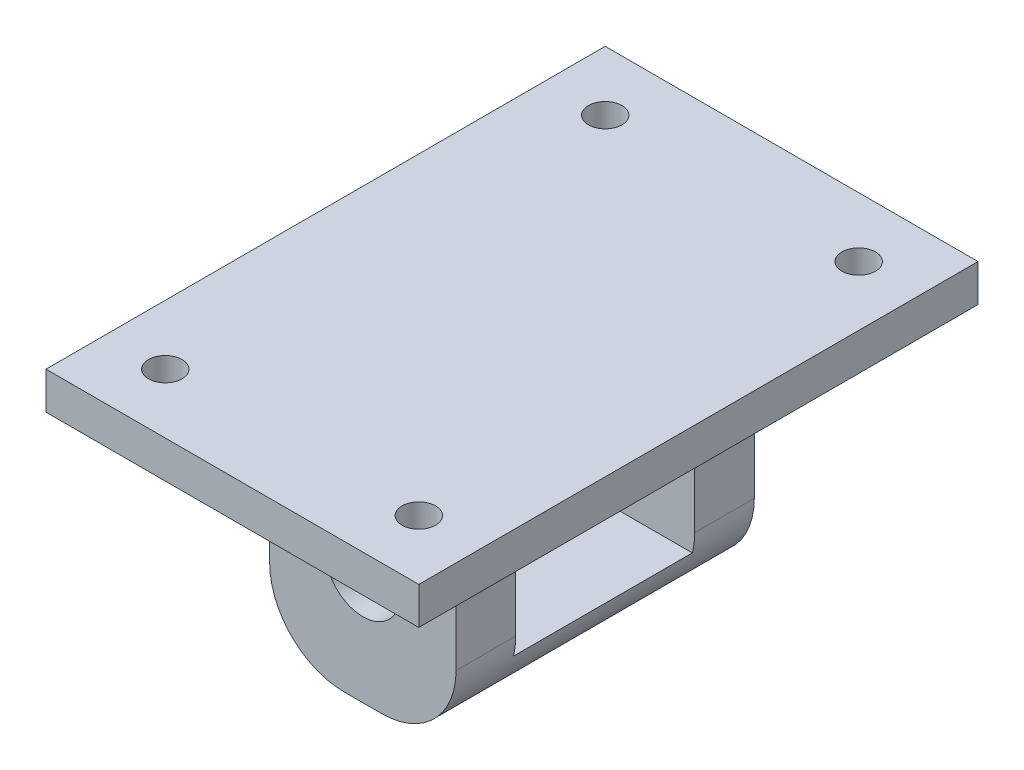
ISO-10303-21;
HEADER;
FILE_DESCRIPTION(('STEP AP214'),'2;1');
FILE_NAME('part.step','',(''),(''),'','','');
FILE_SCHEMA(('AUTOMOTIVE_DESIGN { 1 0 10303 214 1 1 1 1 }'));
ENDSEC;
DATA;
#1=APPLICATION_CONTEXT('core data for automotive mechanical design processes');
#2=APPLICATION_PROTOCOL_DEFINITION('international standard','automotive_design',2000,#1);
#3=PRODUCT_CONTEXT('',#1,'mechanical');
#4=PRODUCT('Part','Part','',(#3));
#5=PRODUCT_RELATED_PRODUCT_CATEGORY('part','',(#4));
#6=PRODUCT_DEFINITION_FORMATION('','',#4);
#7=PRODUCT_DEFINITION_CONTEXT('part definition',#1,'design');
#8=PRODUCT_DEFINITION('design','',#6,#7);
#9=PRODUCT_DEFINITION_SHAPE('','',#8);
#10=(LENGTH_UNIT() NAMED_UNIT(*) SI_UNIT(.MILLI.,.METRE.));
#11=(NAMED_UNIT(*) PLANE_ANGLE_UNIT() SI_UNIT($,.RADIAN.));
#12=(NAMED_UNIT(*) SI_UNIT($,.STERADIAN.) SOLID_ANGLE_UNIT());
#13=UNCERTAINTY_MEASURE_WITH_UNIT(LENGTH_MEASURE(1.E-05),#10,'distance_accuracy_value','');
#14=(GEOMETRIC_REPRESENTATION_CONTEXT(3) GLOBAL_UNCERTAINTY_ASSIGNED_CONTEXT((#13)) GLOBAL_UNIT_ASSIGNED_CONTEXT((#10,
#11,#12)) REPRESENTATION_CONTEXT('',''));
#15=CARTESIAN_POINT('',(0.,0.,0.));
#16=DIRECTION('',(0.,0.,1.));
#17=DIRECTION('',(1.,0.,0.));
#18=AXIS2_PLACEMENT_3D('',#15,#16,#17);
#19=CARTESIAN_POINT('',(0.,20.,0.));
#20=DIRECTION('',(0.,1.,0.));
#21=DIRECTION('',(-1.,0.,0.));
#22=AXIS2_PLACEMENT_3D('',#19,#20,#21);
#23=PLANE('',#22);
#24=CARTESIAN_POINT('',(17.,20.,-29.5));
#25=DIRECTION('',(0.,-1.,0.));
#26=DIRECTION('',(0.,0.,-1.));
#27=AXIS2_PLACEMENT_3D('',#24,#25,#26);
#28=CIRCLE('',#27,2.25);
#29=CARTESIAN_POINT('',(17.,20.,-31.75));
#30=VERTEX_POINT('',#29);
#31=EDGE_CURVE('E423',#30,#30,#28,.T.);
#32=ORIENTED_EDGE('',*,*,#31,.T.);
#33=EDGE_LOOP('',(#32));
#34=FACE_BOUND('',#33,.T.);
#35=CARTESIAN_POINT('',(-17.,20.,-29.5));
#36=DIRECTION('',(0.,-1.,0.));
#37=DIRECTION('',(0.,0.,-1.));
#38=AXIS2_PLACEMENT_3D('',#35,#36,#37);
#39=CIRCLE('',#38,2.25);
#40=CARTESIAN_POINT('',(-17.,20.,-31.75));
#41=VERTEX_POINT('',#40);
#42=EDGE_CURVE('E436',#41,#41,#39,.T.);
#43=ORIENTED_EDGE('',*,*,#42,.T.);
#44=EDGE_LOOP('',(#43));
#45=FACE_BOUND('',#44,.T.);
#46=DIRECTION('',(0.,0.,1.));
#47=VECTOR('',#46,1.);
#48=CARTESIAN_POINT('',(-25.,20.,37.5));
#49=LINE('',#48,#47);
#50=CARTESIAN_POINT('',(-25.,20.,-37.5));
#51=VERTEX_POINT('',#50);
#52=CARTESIAN_POINT('',(-25.,20.,37.5));
#53=VERTEX_POINT('',#52);
#54=EDGE_CURVE('E164',#51,#53,#49,.T.);
#55=ORIENTED_EDGE('',*,*,#54,.T.);
#56=DIRECTION('',(1.,0.,0.));
#57=VECTOR('',#56,1.);
#58=CARTESIAN_POINT('',(25.,20.,37.5));
#59=LINE('',#58,#57);
#60=CARTESIAN_POINT('',(25.,20.,37.5));
#61=VERTEX_POINT('',#60);
#62=EDGE_CURVE('E152',#53,#61,#59,.T.);
#63=ORIENTED_EDGE('',*,*,#62,.T.);
#64=DIRECTION('',(0.,0.,-1.));
#65=VECTOR('',#64,1.);
#66=CARTESIAN_POINT('',(25.,20.,37.5));
#67=LINE('',#66,#65);
#68=CARTESIAN_POINT('',(25.,20.,-37.5));
#69=VERTEX_POINT('',#68);
#70=EDGE_CURVE('E163',#61,#69,#67,.T.);
#71=ORIENTED_EDGE('',*,*,#70,.T.);
#72=DIRECTION('',(-1.,0.,0.));
#73=VECTOR('',#72,1.);
#74=CARTESIAN_POINT('',(25.,20.,-37.5));
#75=LINE('',#74,#73);
#76=EDGE_CURVE('E169',#69,#51,#75,.T.);
#77=ORIENTED_EDGE('',*,*,#76,.T.);
#78=EDGE_LOOP('',(#55,#63,#71,#77));
#79=FACE_BOUND('',#78,.T.);
#80=CARTESIAN_POINT('',(17.,20.,29.5));
#81=DIRECTION('',(0.,-1.,0.));
#82=DIRECTION('',(0.,0.,-1.));
#83=AXIS2_PLACEMENT_3D('',#80,#81,#82);
#84=CIRCLE('',#83,2.25);
#85=CARTESIAN_POINT('',(17.,20.,27.25));
#86=VERTEX_POINT('',#85);
#87=EDGE_CURVE('E460',#86,#86,#84,.T.);
#88=ORIENTED_EDGE('',*,*,#87,.T.);
#89=EDGE_LOOP('',(#88));
#90=FACE_BOUND('',#89,.T.);
#91=CARTESIAN_POINT('',(-17.,20.,29.5));
#92=DIRECTION('',(0.,-1.,0.));
#93=DIRECTION('',(0.,0.,-1.));
#94=AXIS2_PLACEMENT_3D('',#91,#92,#93);
#95=CIRCLE('',#94,2.25);
#96=CARTESIAN_POINT('',(-17.,20.,27.25));
#97=VERTEX_POINT('',#96);
#98=EDGE_CURVE('E448',#97,#97,#95,.T.);
#99=ORIENTED_EDGE('',*,*,#98,.T.);
#100=EDGE_LOOP('',(#99));
#101=FACE_BOUND('',#100,.T.);
#102=ADVANCED_FACE('F44',(#34,#45,#79,#90,#101),#23,.T.);
#103=CARTESIAN_POINT('',(-12.5,-15.,20.));
#104=DIRECTION('',(1.,0.,0.));
#105=DIRECTION('',(0.,1.,0.));
#106=AXIS2_PLACEMENT_3D('',#103,#104,#105);
#107=PLANE('',#106);
#108=DIRECTION('',(0.,-1.,0.));
#109=VECTOR('',#108,1.);
#110=CARTESIAN_POINT('',(-12.5,-15.,-20.));
#111=LINE('',#110,#109);
#112=CARTESIAN_POINT('',(-12.5,15.,-20.));
#113=VERTEX_POINT('',#112);
#114=CARTESIAN_POINT('',(-12.5,-4.99999999999999,-20.));
#115=VERTEX_POINT('',#114);
#116=EDGE_CURVE('E225',#113,#115,#111,.T.);
#117=ORIENTED_EDGE('',*,*,#116,.T.);
#118=DIRECTION('',(0.,0.,-1.));
#119=VECTOR('',#118,1.);
#120=CARTESIAN_POINT('',(-12.5,-4.99999999999999,20.));
#121=LINE('',#120,#119);
#122=CARTESIAN_POINT('',(-12.5,-4.99999999999999,20.));
#123=VERTEX_POINT('',#122);
#124=EDGE_CURVE('E287',#115,#123,#121,.F.);
#125=ORIENTED_EDGE('',*,*,#124,.T.);
#126=DIRECTION('',(0.,-1.,0.));
#127=VECTOR('',#126,1.);
#128=CARTESIAN_POINT('',(-12.5,-15.,20.));
#129=LINE('',#128,#127);
#130=CARTESIAN_POINT('',(-12.5,15.,20.));
#131=VERTEX_POINT('',#130);
#132=EDGE_CURVE('E226',#131,#123,#129,.T.);
#133=ORIENTED_EDGE('',*,*,#132,.F.);
#134=DIRECTION('',(0.,0.,-1.));
#135=VECTOR('',#134,1.);
#136=CARTESIAN_POINT('',(-12.5,15.,20.));
#137=LINE('',#136,#135);
#138=EDGE_CURVE('E241',#131,#113,#137,.T.);
#139=ORIENTED_EDGE('',*,*,#138,.T.);
#140=EDGE_LOOP('',(#117,#125,#133,#139));
#141=FACE_BOUND('',#140,.T.);
#142=ADVANCED_FACE('F350',(#141),#107,.F.);
#143=CARTESIAN_POINT('',(12.5,-15.,20.));
#144=DIRECTION('',(0.,1.,0.));
#145=DIRECTION('',(0.,0.,1.));
#146=AXIS2_PLACEMENT_3D('',#143,#144,#145);
#147=PLANE('',#146);
#148=DIRECTION('',(1.,0.,0.));
#149=VECTOR('',#148,1.);
#150=CARTESIAN_POINT('',(12.5,-15.,20.));
#151=LINE('',#150,#149);
#152=CARTESIAN_POINT('',(-2.5,-15.,20.));
#153=VERTEX_POINT('',#152);
#154=CARTESIAN_POINT('',(2.5,-15.,20.));
#155=VERTEX_POINT('',#154);
#156=EDGE_CURVE('E230',#153,#155,#151,.T.);
#157=ORIENTED_EDGE('',*,*,#156,.F.);
#158=DIRECTION('',(0.,0.,-1.));
#159=VECTOR('',#158,1.);
#160=CARTESIAN_POINT('',(-2.5,-15.,20.));
#161=LINE('',#160,#159);
#162=CARTESIAN_POINT('',(-2.5,-15.,-20.));
#163=VERTEX_POINT('',#162);
#164=EDGE_CURVE('E277',#153,#163,#161,.T.);
#165=ORIENTED_EDGE('',*,*,#164,.T.);
#166=DIRECTION('',(1.,0.,0.));
#167=VECTOR('',#166,1.);
#168=CARTESIAN_POINT('',(12.5,-15.,-20.));
#169=LINE('',#168,#167);
#170=CARTESIAN_POINT('',(2.5,-15.,-20.));
#171=VERTEX_POINT('',#170);
#172=EDGE_CURVE('E245',#163,#171,#169,.T.);
#173=ORIENTED_EDGE('',*,*,#172,.T.);
#174=DIRECTION('',(0.,0.,-1.));
#175=VECTOR('',#174,1.);
#176=CARTESIAN_POINT('',(2.5,-15.,20.));
#177=LINE('',#176,#175);
#178=EDGE_CURVE('E271',#171,#155,#177,.F.);
#179=ORIENTED_EDGE('',*,*,#178,.T.);
#180=EDGE_LOOP('',(#157,#165,#173,#179));
#181=FACE_BOUND('',#180,.T.);
#182=ADVANCED_FACE('F340',(#181),#147,.F.);
#183=CARTESIAN_POINT('',(12.5,-15.,20.));
#184=DIRECTION('',(-1.,0.,0.));
#185=DIRECTION('',(0.,-1.,0.));
#186=AXIS2_PLACEMENT_3D('',#183,#184,#185);
#187=PLANE('',#186);
#188=DIRECTION('',(0.,1.,0.));
#189=VECTOR('',#188,1.);
#190=CARTESIAN_POINT('',(12.5,-15.,20.));
#191=LINE('',#190,#189);
#192=CARTESIAN_POINT('',(12.5,-4.99999999999999,20.));
#193=VERTEX_POINT('',#192);
#194=CARTESIAN_POINT('',(12.5,15.,20.));
#195=VERTEX_POINT('',#194);
#196=EDGE_CURVE('E235',#193,#195,#191,.T.);
#197=ORIENTED_EDGE('',*,*,#196,.F.);
#198=DIRECTION('',(0.,0.,-1.));
#199=VECTOR('',#198,1.);
#200=CARTESIAN_POINT('',(12.5,-4.99999999999999,20.));
#201=LINE('',#200,#199);
#202=CARTESIAN_POINT('',(12.5,-4.99999999999999,12.));
#203=VERTEX_POINT('',#202);
#204=EDGE_CURVE('E299',#193,#203,#201,.T.);
#205=ORIENTED_EDGE('',*,*,#204,.T.);
#206=DIRECTION('',(0.,1.,0.));
#207=VECTOR('',#206,1.);
#208=CARTESIAN_POINT('',(12.5,-15.,12.));
#209=LINE('',#208,#207);
#210=CARTESIAN_POINT('',(12.5,7.5,12.));
#211=VERTEX_POINT('',#210);
#212=EDGE_CURVE('E268',#203,#211,#209,.T.);
#213=ORIENTED_EDGE('',*,*,#212,.T.);
#214=DIRECTION('',(0.,0.,1.));
#215=VECTOR('',#214,1.);
#216=CARTESIAN_POINT('',(12.5,7.5,20.));
#217=LINE('',#216,#215);
#218=CARTESIAN_POINT('',(12.5,7.5,-12.));
#219=VERTEX_POINT('',#218);
#220=EDGE_CURVE('E264',#219,#211,#217,.T.);
#221=ORIENTED_EDGE('',*,*,#220,.F.);
#222=DIRECTION('',(0.,1.,0.));
#223=VECTOR('',#222,1.);
#224=CARTESIAN_POINT('',(12.5,-15.,-12.));
#225=LINE('',#224,#223);
#226=CARTESIAN_POINT('',(12.5,-4.99999999999999,-12.));
#227=VERTEX_POINT('',#226);
#228=EDGE_CURVE('E261',#227,#219,#225,.T.);
#229=ORIENTED_EDGE('',*,*,#228,.F.);
#230=DIRECTION('',(0.,0.,-1.));
#231=VECTOR('',#230,1.);
#232=CARTESIAN_POINT('',(12.5,-4.99999999999999,20.));
#233=LINE('',#232,#231);
#234=CARTESIAN_POINT('',(12.5,-4.99999999999999,-20.));
#235=VERTEX_POINT('',#234);
#236=EDGE_CURVE('E296',#227,#235,#233,.T.);
#237=ORIENTED_EDGE('',*,*,#236,.T.);
#238=DIRECTION('',(0.,1.,0.));
#239=VECTOR('',#238,1.);
#240=CARTESIAN_POINT('',(12.5,-15.,-20.));
#241=LINE('',#240,#239);
#242=CARTESIAN_POINT('',(12.5,15.,-20.));
#243=VERTEX_POINT('',#242);
#244=EDGE_CURVE('E249',#235,#243,#241,.T.);
#245=ORIENTED_EDGE('',*,*,#244,.T.);
#246=DIRECTION('',(0.,0.,-1.));
#247=VECTOR('',#246,1.);
#248=CARTESIAN_POINT('',(12.5,15.,20.));
#249=LINE('',#248,#247);
#250=EDGE_CURVE('E257',#195,#243,#249,.T.);
#251=ORIENTED_EDGE('',*,*,#250,.F.);
#252=EDGE_LOOP('',(#197,#205,#213,#221,#229,#237,#245,#251));
#253=FACE_BOUND('',#252,.T.);
#254=ADVANCED_FACE('F308',(#253),#187,.F.);
#255=CARTESIAN_POINT('',(0.,0.,20.));
#256=DIRECTION('',(0.,0.,1.));
#257=DIRECTION('',(1.,0.,0.));
#258=AXIS2_PLACEMENT_3D('',#255,#256,#257);
#259=PLANE('',#258);
#260=CARTESIAN_POINT('',(0.,0.,20.));
#261=DIRECTION('',(0.,0.,1.));
#262=DIRECTION('',(1.,0.,0.));
#263=AXIS2_PLACEMENT_3D('',#260,#261,#262);
#264=CIRCLE('',#263,5.);
#265=CARTESIAN_POINT('',(5.,0.,20.));
#266=VERTEX_POINT('',#265);
#267=EDGE_CURVE('E180',#266,#266,#264,.T.);
#268=ORIENTED_EDGE('',*,*,#267,.F.);
#269=EDGE_LOOP('',(#268));
#270=FACE_BOUND('',#269,.T.);
#271=ORIENTED_EDGE('',*,*,#132,.T.);
#272=CARTESIAN_POINT('',(-2.5,-4.99999999999999,20.));
#273=DIRECTION('',(0.,0.,1.));
#274=DIRECTION('',(1.,0.,0.));
#275=AXIS2_PLACEMENT_3D('',#272,#273,#274);
#276=CIRCLE('',#275,10.);
#277=EDGE_CURVE('E293',#123,#153,#276,.T.);
#278=ORIENTED_EDGE('',*,*,#277,.T.);
#279=ORIENTED_EDGE('',*,*,#156,.T.);
#280=CARTESIAN_POINT('',(2.5,-4.99999999999999,20.));
#281=DIRECTION('',(0.,0.,1.));
#282=DIRECTION('',(1.,0.,0.));
#283=AXIS2_PLACEMENT_3D('',#280,#281,#282);
#284=CIRCLE('',#283,10.);
#285=EDGE_CURVE('E290',#155,#193,#284,.T.);
#286=ORIENTED_EDGE('',*,*,#285,.T.);
#287=ORIENTED_EDGE('',*,*,#196,.T.);
#288=DIRECTION('',(-1.,0.,0.));
#289=VECTOR('',#288,1.);
#290=CARTESIAN_POINT('',(12.5,15.,20.));
#291=LINE('',#290,#289);
#292=EDGE_CURVE('E238',#195,#131,#291,.T.);
#293=ORIENTED_EDGE('',*,*,#292,.T.);
#294=EDGE_LOOP('',(#271,#278,#279,#286,#287,#293));
#295=FACE_BOUND('',#294,.T.);
#296=ADVANCED_FACE('F343',(#270,#295),#259,.T.);
#297=CARTESIAN_POINT('',(0.,0.,-20.));
#298=DIRECTION('',(0.,0.,1.));
#299=DIRECTION('',(1.,0.,0.));
#300=AXIS2_PLACEMENT_3D('',#297,#298,#299);
#301=PLANE('',#300);
#302=CARTESIAN_POINT('',(0.,0.,-20.));
#303=DIRECTION('',(0.,0.,1.));
#304=DIRECTION('',(1.,0.,0.));
#305=AXIS2_PLACEMENT_3D('',#302,#303,#304);
#306=CIRCLE('',#305,5.);
#307=CARTESIAN_POINT('',(5.,0.,-20.));
#308=VERTEX_POINT('',#307);
#309=EDGE_CURVE('E185',#308,#308,#306,.T.);
#310=ORIENTED_EDGE('',*,*,#309,.T.);
#311=EDGE_LOOP('',(#310));
#312=FACE_BOUND('',#311,.T.);
#313=ORIENTED_EDGE('',*,*,#172,.F.);
#314=CARTESIAN_POINT('',(-2.5,-4.99999999999999,-20.));
#315=DIRECTION('',(0.,0.,1.));
#316=DIRECTION('',(1.,0.,0.));
#317=AXIS2_PLACEMENT_3D('',#314,#315,#316);
#318=CIRCLE('',#317,10.);
#319=EDGE_CURVE('E284',#163,#115,#318,.F.);
#320=ORIENTED_EDGE('',*,*,#319,.T.);
#321=ORIENTED_EDGE('',*,*,#116,.F.);
#322=DIRECTION('',(-1.,0.,0.));
#323=VECTOR('',#322,1.);
#324=CARTESIAN_POINT('',(12.5,15.,-20.));
#325=LINE('',#324,#323);
#326=EDGE_CURVE('E231',#243,#113,#325,.T.);
#327=ORIENTED_EDGE('',*,*,#326,.F.);
#328=ORIENTED_EDGE('',*,*,#244,.F.);
#329=CARTESIAN_POINT('',(2.5,-4.99999999999999,-20.));
#330=DIRECTION('',(0.,0.,1.));
#331=DIRECTION('',(1.,0.,0.));
#332=AXIS2_PLACEMENT_3D('',#329,#330,#331);
#333=CIRCLE('',#332,10.);
#334=EDGE_CURVE('E281',#235,#171,#333,.F.);
#335=ORIENTED_EDGE('',*,*,#334,.T.);
#336=EDGE_LOOP('',(#313,#320,#321,#327,#328,#335));
#337=FACE_BOUND('',#336,.T.);
#338=ADVANCED_FACE('F335',(#312,#337),#301,.F.);
#339=CARTESIAN_POINT('',(0.,7.5,12.));
#340=DIRECTION('',(0.,-1.,0.));
#341=DIRECTION('',(1.,0.,0.));
#342=AXIS2_PLACEMENT_3D('',#339,#340,#341);
#343=PLANE('',#342);
#344=ORIENTED_EDGE('',*,*,#220,.T.);
#345=DIRECTION('',(-1.,0.,0.));
#346=VECTOR('',#345,1.);
#347=CARTESIAN_POINT('',(0.,7.5,12.));
#348=LINE('',#347,#346);
#349=CARTESIAN_POINT('',(0.,7.5,12.));
#350=VERTEX_POINT('',#349);
#351=EDGE_CURVE('E209',#211,#350,#348,.T.);
#352=ORIENTED_EDGE('',*,*,#351,.T.);
#353=DIRECTION('',(0.,0.,-1.));
#354=VECTOR('',#353,1.);
#355=CARTESIAN_POINT('',(0.,7.5,12.));
#356=LINE('',#355,#354);
#357=CARTESIAN_POINT('',(0.,7.5,-12.));
#358=VERTEX_POINT('',#357);
#359=EDGE_CURVE('E221',#350,#358,#356,.T.);
#360=ORIENTED_EDGE('',*,*,#359,.T.);
#361=DIRECTION('',(-1.,0.,0.));
#362=VECTOR('',#361,1.);
#363=CARTESIAN_POINT('',(0.,7.5,-12.));
#364=LINE('',#363,#362);
#365=EDGE_CURVE('E199',#219,#358,#364,.T.);
#366=ORIENTED_EDGE('',*,*,#365,.F.);
#367=EDGE_LOOP('',(#344,#352,#360,#366));
#368=FACE_BOUND('',#367,.T.);
#369=ADVANCED_FACE('F318',(#368),#343,.T.);
#370=CARTESIAN_POINT('',(21.3989106401337,-7.5,12.));
#371=DIRECTION('',(0.,1.,0.));
#372=DIRECTION('',(0.,0.,1.));
#373=AXIS2_PLACEMENT_3D('',#370,#371,#372);
#374=PLANE('',#373);
#375=DIRECTION('',(1.,0.,0.));
#376=VECTOR('',#375,1.);
#377=CARTESIAN_POINT('',(21.3989106401337,-7.5,12.));
#378=LINE('',#377,#376);
#379=CARTESIAN_POINT('',(0.,-7.5,12.));
#380=VERTEX_POINT('',#379);
#381=CARTESIAN_POINT('',(12.1824583655185,-7.5,12.));
#382=VERTEX_POINT('',#381);
#383=EDGE_CURVE('E215',#380,#382,#378,.T.);
#384=ORIENTED_EDGE('',*,*,#383,.T.);
#385=DIRECTION('',(0.,0.,-1.));
#386=VECTOR('',#385,1.);
#387=CARTESIAN_POINT('',(12.1824583655185,-7.5,12.));
#388=LINE('',#387,#386);
#389=CARTESIAN_POINT('',(12.1824583655185,-7.5,-12.));
#390=VERTEX_POINT('',#389);
#391=EDGE_CURVE('E53',#382,#390,#388,.T.);
#392=ORIENTED_EDGE('',*,*,#391,.T.);
#393=DIRECTION('',(1.,0.,0.));
#394=VECTOR('',#393,1.);
#395=CARTESIAN_POINT('',(21.3989106401337,-7.5,-12.));
#396=LINE('',#395,#394);
#397=CARTESIAN_POINT('',(0.,-7.5,-12.));
#398=VERTEX_POINT('',#397);
#399=EDGE_CURVE('E206',#398,#390,#396,.T.);
#400=ORIENTED_EDGE('',*,*,#399,.F.);
#401=DIRECTION('',(0.,0.,-1.));
#402=VECTOR('',#401,1.);
#403=CARTESIAN_POINT('',(0.,-7.5,12.));
#404=LINE('',#403,#402);
#405=EDGE_CURVE('E218',#380,#398,#404,.T.);
#406=ORIENTED_EDGE('',*,*,#405,.F.);
#407=EDGE_LOOP('',(#384,#392,#400,#406));
#408=FACE_BOUND('',#407,.T.);
#409=ADVANCED_FACE('F327',(#408),#374,.T.);
#410=CARTESIAN_POINT('',(0.,0.,12.));
#411=DIRECTION('',(0.,0.,1.));
#412=DIRECTION('',(1.,0.,0.));
#413=AXIS2_PLACEMENT_3D('',#410,#411,#412);
#414=PLANE('',#413);
#415=CARTESIAN_POINT('',(0.,0.,12.));
#416=DIRECTION('',(0.,0.,1.));
#417=DIRECTION('',(1.,0.,0.));
#418=AXIS2_PLACEMENT_3D('',#415,#416,#417);
#419=CIRCLE('',#418,5.);
#420=CARTESIAN_POINT('',(5.,0.,12.));
#421=VERTEX_POINT('',#420);
#422=EDGE_CURVE('E195',#421,#421,#419,.T.);
#423=ORIENTED_EDGE('',*,*,#422,.T.);
#424=EDGE_LOOP('',(#423));
#425=FACE_BOUND('',#424,.T.);
#426=ORIENTED_EDGE('',*,*,#212,.F.);
#427=CARTESIAN_POINT('',(2.5,-4.99999999999999,12.));
#428=DIRECTION('',(0.,0.,1.));
#429=DIRECTION('',(1.,0.,0.));
#430=AXIS2_PLACEMENT_3D('',#427,#428,#429);
#431=CIRCLE('',#430,10.);
#432=EDGE_CURVE('E67',#203,#382,#431,.F.);
#433=ORIENTED_EDGE('',*,*,#432,.T.);
#434=ORIENTED_EDGE('',*,*,#383,.F.);
#435=CARTESIAN_POINT('',(0.,0.,12.));
#436=DIRECTION('',(0.,0.,1.));
#437=DIRECTION('',(1.,0.,0.));
#438=AXIS2_PLACEMENT_3D('',#435,#436,#437);
#439=CIRCLE('',#438,7.5);
#440=EDGE_CURVE('E212',#350,#380,#439,.T.);
#441=ORIENTED_EDGE('',*,*,#440,.F.);
#442=ORIENTED_EDGE('',*,*,#351,.F.);
#443=EDGE_LOOP('',(#426,#433,#434,#441,#442));
#444=FACE_BOUND('',#443,.T.);
#445=ADVANCED_FACE('F314',(#425,#444),#414,.F.);
#446=CARTESIAN_POINT('',(0.,0.,-12.));
#447=DIRECTION('',(0.,0.,1.));
#448=DIRECTION('',(1.,0.,0.));
#449=AXIS2_PLACEMENT_3D('',#446,#447,#448);
#450=PLANE('',#449);
#451=CARTESIAN_POINT('',(0.,0.,-12.));
#452=DIRECTION('',(0.,0.,1.));
#453=DIRECTION('',(1.,0.,0.));
#454=AXIS2_PLACEMENT_3D('',#451,#452,#453);
#455=CIRCLE('',#454,5.);
#456=CARTESIAN_POINT('',(5.,0.,-12.));
#457=VERTEX_POINT('',#456);
#458=EDGE_CURVE('E193',#457,#457,#455,.T.);
#459=ORIENTED_EDGE('',*,*,#458,.F.);
#460=EDGE_LOOP('',(#459));
#461=FACE_BOUND('',#460,.T.);
#462=ORIENTED_EDGE('',*,*,#399,.T.);
#463=CARTESIAN_POINT('',(2.5,-4.99999999999999,-12.));
#464=DIRECTION('',(0.,0.,1.));
#465=DIRECTION('',(1.,0.,0.));
#466=AXIS2_PLACEMENT_3D('',#463,#464,#465);
#467=CIRCLE('',#466,10.);
#468=EDGE_CURVE('E11',#390,#227,#467,.T.);
#469=ORIENTED_EDGE('',*,*,#468,.T.);
#470=ORIENTED_EDGE('',*,*,#228,.T.);
#471=ORIENTED_EDGE('',*,*,#365,.T.);
#472=CARTESIAN_POINT('',(0.,0.,-12.));
#473=DIRECTION('',(0.,0.,1.));
#474=DIRECTION('',(1.,0.,0.));
#475=AXIS2_PLACEMENT_3D('',#472,#473,#474);
#476=CIRCLE('',#475,7.5);
#477=EDGE_CURVE('E202',#358,#398,#476,.T.);
#478=ORIENTED_EDGE('',*,*,#477,.T.);
#479=EDGE_LOOP('',(#462,#469,#470,#471,#478));
#480=FACE_BOUND('',#479,.T.);
#481=ADVANCED_FACE('F325',(#461,#480),#450,.T.);
#482=CARTESIAN_POINT('',(0.,0.,12.));
#483=DIRECTION('',(0.,0.,-1.));
#484=DIRECTION('',(-1.,0.,0.));
#485=AXIS2_PLACEMENT_3D('',#482,#483,#484);
#486=CYLINDRICAL_SURFACE('',#485,7.5);
#487=ORIENTED_EDGE('',*,*,#359,.F.);
#488=ORIENTED_EDGE('',*,*,#440,.T.);
#489=ORIENTED_EDGE('',*,*,#405,.T.);
#490=ORIENTED_EDGE('',*,*,#477,.F.);
#491=EDGE_LOOP('',(#487,#488,#489,#490));
#492=FACE_BOUND('',#491,.T.);
#493=ADVANCED_FACE('F322',(#492),#486,.F.);
#494=CARTESIAN_POINT('',(0.,0.,-20.));
#495=DIRECTION('',(0.,0.,1.));
#496=DIRECTION('',(1.,0.,0.));
#497=AXIS2_PLACEMENT_3D('',#494,#495,#496);
#498=CYLINDRICAL_SURFACE('',#497,5.);
#499=ORIENTED_EDGE('',*,*,#458,.T.);
#500=EDGE_LOOP('',(#499));
#501=FACE_BOUND('',#500,.T.);
#502=ORIENTED_EDGE('',*,*,#309,.F.);
#503=EDGE_LOOP('',(#502));
#504=FACE_BOUND('',#503,.T.);
#505=ADVANCED_FACE('F366',(#501,#504),#498,.F.);
#506=ORIENTED_EDGE('',*,*,#267,.T.);
#507=EDGE_LOOP('',(#506));
#508=FACE_BOUND('',#507,.T.);
#509=ORIENTED_EDGE('',*,*,#422,.F.);
#510=EDGE_LOOP('',(#509));
#511=FACE_BOUND('',#510,.T.);
#512=ADVANCED_FACE('F356',(#508,#511),#498,.F.);
#513=CARTESIAN_POINT('',(0.,15.,0.));
#514=DIRECTION('',(0.,1.,0.));
#515=DIRECTION('',(-1.,0.,0.));
#516=AXIS2_PLACEMENT_3D('',#513,#514,#515);
#517=PLANE('',#516);
#518=CARTESIAN_POINT('',(17.,15.,-29.5));
#519=DIRECTION('',(0.,-1.,0.));
#520=DIRECTION('',(0.,0.,-1.));
#521=AXIS2_PLACEMENT_3D('',#518,#519,#520);
#522=CIRCLE('',#521,2.275);
#523=CARTESIAN_POINT('',(17.,15.,-31.775));
#524=VERTEX_POINT('',#523);
#525=EDGE_CURVE('E419',#524,#524,#522,.T.);
#526=ORIENTED_EDGE('',*,*,#525,.F.);
#527=EDGE_LOOP('',(#526));
#528=FACE_BOUND('',#527,.T.);
#529=CARTESIAN_POINT('',(-17.,15.,-29.5));
#530=DIRECTION('',(0.,-1.,0.));
#531=DIRECTION('',(0.,0.,-1.));
#532=AXIS2_PLACEMENT_3D('',#529,#530,#531);
#533=CIRCLE('',#532,2.275);
#534=CARTESIAN_POINT('',(-17.,15.,-31.775));
#535=VERTEX_POINT('',#534);
#536=EDGE_CURVE('E428',#535,#535,#533,.T.);
#537=ORIENTED_EDGE('',*,*,#536,.F.);
#538=EDGE_LOOP('',(#537));
#539=FACE_BOUND('',#538,.T.);
#540=CARTESIAN_POINT('',(-17.,15.,29.5));
#541=DIRECTION('',(0.,-1.,0.));
#542=DIRECTION('',(0.,0.,-1.));
#543=AXIS2_PLACEMENT_3D('',#540,#541,#542);
#544=CIRCLE('',#543,2.275);
#545=CARTESIAN_POINT('',(-17.,15.,27.225));
#546=VERTEX_POINT('',#545);
#547=EDGE_CURVE('E440',#546,#546,#544,.T.);
#548=ORIENTED_EDGE('',*,*,#547,.F.);
#549=EDGE_LOOP('',(#548));
#550=FACE_BOUND('',#549,.T.);
#551=CARTESIAN_POINT('',(17.,15.,29.5));
#552=DIRECTION('',(0.,-1.,0.));
#553=DIRECTION('',(0.,0.,-1.));
#554=AXIS2_PLACEMENT_3D('',#551,#552,#553);
#555=CIRCLE('',#554,2.275);
#556=CARTESIAN_POINT('',(17.,15.,27.225));
#557=VERTEX_POINT('',#556);
#558=EDGE_CURVE('E452',#557,#557,#555,.T.);
#559=ORIENTED_EDGE('',*,*,#558,.F.);
#560=EDGE_LOOP('',(#559));
#561=FACE_BOUND('',#560,.T.);
#562=DIRECTION('',(0.,0.,1.));
#563=VECTOR('',#562,1.);
#564=CARTESIAN_POINT('',(-25.,15.,37.5));
#565=LINE('',#564,#563);
#566=CARTESIAN_POINT('',(-25.,15.,-37.5));
#567=VERTEX_POINT('',#566);
#568=CARTESIAN_POINT('',(-25.,15.,37.5));
#569=VERTEX_POINT('',#568);
#570=EDGE_CURVE('E178',#567,#569,#565,.T.);
#571=ORIENTED_EDGE('',*,*,#570,.F.);
#572=DIRECTION('',(-1.,0.,0.));
#573=VECTOR('',#572,1.);
#574=CARTESIAN_POINT('',(25.,15.,-37.5));
#575=LINE('',#574,#573);
#576=CARTESIAN_POINT('',(25.,15.,-37.5));
#577=VERTEX_POINT('',#576);
#578=EDGE_CURVE('E174',#577,#567,#575,.T.);
#579=ORIENTED_EDGE('',*,*,#578,.F.);
#580=DIRECTION('',(0.,0.,-1.));
#581=VECTOR('',#580,1.);
#582=CARTESIAN_POINT('',(25.,15.,37.5));
#583=LINE('',#582,#581);
#584=CARTESIAN_POINT('',(25.,15.,37.5));
#585=VERTEX_POINT('',#584);
#586=EDGE_CURVE('E474',#585,#577,#583,.T.);
#587=ORIENTED_EDGE('',*,*,#586,.F.);
#588=DIRECTION('',(1.,0.,0.));
#589=VECTOR('',#588,1.);
#590=CARTESIAN_POINT('',(25.,15.,37.5));
#591=LINE('',#590,#589);
#592=EDGE_CURVE('E471',#569,#585,#591,.T.);
#593=ORIENTED_EDGE('',*,*,#592,.F.);
#594=EDGE_LOOP('',(#571,#579,#587,#593));
#595=FACE_BOUND('',#594,.T.);
#596=ORIENTED_EDGE('',*,*,#250,.T.);
#597=ORIENTED_EDGE('',*,*,#326,.T.);
#598=ORIENTED_EDGE('',*,*,#138,.F.);
#599=ORIENTED_EDGE('',*,*,#292,.F.);
#600=EDGE_LOOP('',(#596,#597,#598,#599));
#601=FACE_BOUND('',#600,.T.);
#602=ADVANCED_FACE('F354',(#528,#539,#550,#561,#595,#601),#517,.F.);
#603=CARTESIAN_POINT('',(-25.,20.,37.5));
#604=DIRECTION('',(1.,0.,0.));
#605=DIRECTION('',(0.,1.,0.));
#606=AXIS2_PLACEMENT_3D('',#603,#604,#605);
#607=PLANE('',#606);
#608=ORIENTED_EDGE('',*,*,#570,.T.);
#609=DIRECTION('',(0.,-1.,0.));
#610=VECTOR('',#609,1.);
#611=CARTESIAN_POINT('',(-25.,20.,37.5));
#612=LINE('',#611,#610);
#613=EDGE_CURVE('E156',#53,#569,#612,.T.);
#614=ORIENTED_EDGE('',*,*,#613,.F.);
#615=ORIENTED_EDGE('',*,*,#54,.F.);
#616=DIRECTION('',(0.,-1.,0.));
#617=VECTOR('',#616,1.);
#618=CARTESIAN_POINT('',(-25.,20.,-37.5));
#619=LINE('',#618,#617);
#620=EDGE_CURVE('E468',#51,#567,#619,.T.);
#621=ORIENTED_EDGE('',*,*,#620,.T.);
#622=EDGE_LOOP('',(#608,#614,#615,#621));
#623=FACE_BOUND('',#622,.T.);
#624=ADVANCED_FACE('F176',(#623),#607,.F.);
#625=CARTESIAN_POINT('',(25.,20.,37.5));
#626=DIRECTION('',(0.,0.,-1.));
#627=DIRECTION('',(-1.,0.,0.));
#628=AXIS2_PLACEMENT_3D('',#625,#626,#627);
#629=PLANE('',#628);
#630=ORIENTED_EDGE('',*,*,#592,.T.);
#631=DIRECTION('',(0.,-1.,0.));
#632=VECTOR('',#631,1.);
#633=CARTESIAN_POINT('',(25.,20.,37.5));
#634=LINE('',#633,#632);
#635=EDGE_CURVE('E159',#61,#585,#634,.T.);
#636=ORIENTED_EDGE('',*,*,#635,.F.);
#637=ORIENTED_EDGE('',*,*,#62,.F.);
#638=ORIENTED_EDGE('',*,*,#613,.T.);
#639=EDGE_LOOP('',(#630,#636,#637,#638));
#640=FACE_BOUND('',#639,.T.);
#641=ADVANCED_FACE('F154',(#640),#629,.F.);
#642=CARTESIAN_POINT('',(25.,20.,37.5));
#643=DIRECTION('',(-1.,0.,0.));
#644=DIRECTION('',(0.,-1.,0.));
#645=AXIS2_PLACEMENT_3D('',#642,#643,#644);
#646=PLANE('',#645);
#647=ORIENTED_EDGE('',*,*,#586,.T.);
#648=DIRECTION('',(0.,-1.,0.));
#649=VECTOR('',#648,1.);
#650=CARTESIAN_POINT('',(25.,20.,-37.5));
#651=LINE('',#650,#649);
#652=EDGE_CURVE('E187',#69,#577,#651,.T.);
#653=ORIENTED_EDGE('',*,*,#652,.F.);
#654=ORIENTED_EDGE('',*,*,#70,.F.);
#655=ORIENTED_EDGE('',*,*,#635,.T.);
#656=EDGE_LOOP('',(#647,#653,#654,#655));
#657=FACE_BOUND('',#656,.T.);
#658=ADVANCED_FACE('F489',(#657),#646,.F.);
#659=CARTESIAN_POINT('',(25.,20.,-37.5));
#660=DIRECTION('',(0.,0.,1.));
#661=DIRECTION('',(1.,0.,0.));
#662=AXIS2_PLACEMENT_3D('',#659,#660,#661);
#663=PLANE('',#662);
#664=ORIENTED_EDGE('',*,*,#578,.T.);
#665=ORIENTED_EDGE('',*,*,#620,.F.);
#666=ORIENTED_EDGE('',*,*,#76,.F.);
#667=ORIENTED_EDGE('',*,*,#652,.T.);
#668=EDGE_LOOP('',(#664,#665,#666,#667));
#669=FACE_BOUND('',#668,.T.);
#670=ADVANCED_FACE('F485',(#669),#663,.F.);
#671=CARTESIAN_POINT('',(-2.5,-4.99999999999999,20.));
#672=DIRECTION('',(0.,0.,-1.));
#673=DIRECTION('',(-1.,0.,0.));
#674=AXIS2_PLACEMENT_3D('',#671,#672,#673);
#675=CYLINDRICAL_SURFACE('',#674,10.);
#676=ORIENTED_EDGE('',*,*,#277,.F.);
#677=ORIENTED_EDGE('',*,*,#124,.F.);
#678=ORIENTED_EDGE('',*,*,#319,.F.);
#679=ORIENTED_EDGE('',*,*,#164,.F.);
#680=EDGE_LOOP('',(#676,#677,#678,#679));
#681=FACE_BOUND('',#680,.T.);
#682=ADVANCED_FACE('F348',(#681),#675,.T.);
#683=CARTESIAN_POINT('',(2.5,-4.99999999999999,20.));
#684=DIRECTION('',(0.,0.,-1.));
#685=DIRECTION('',(-1.,0.,0.));
#686=AXIS2_PLACEMENT_3D('',#683,#684,#685);
#687=CYLINDRICAL_SURFACE('',#686,10.);
#688=ORIENTED_EDGE('',*,*,#285,.F.);
#689=ORIENTED_EDGE('',*,*,#178,.F.);
#690=ORIENTED_EDGE('',*,*,#334,.F.);
#691=ORIENTED_EDGE('',*,*,#236,.F.);
#692=ORIENTED_EDGE('',*,*,#468,.F.);
#693=ORIENTED_EDGE('',*,*,#391,.F.);
#694=ORIENTED_EDGE('',*,*,#432,.F.);
#695=ORIENTED_EDGE('',*,*,#204,.F.);
#696=EDGE_LOOP('',(#688,#689,#690,#691,#692,#693,#694,#695));
#697=FACE_BOUND('',#696,.T.);
#698=ADVANCED_FACE('F46',(#697),#687,.T.);
#699=CARTESIAN_POINT('',(17.,15.,29.5));
#700=DIRECTION('',(0.,-1.,0.));
#701=DIRECTION('',(0.,0.,-1.));
#702=AXIS2_PLACEMENT_3D('',#699,#700,#701);
#703=CYLINDRICAL_SURFACE('',#702,2.24999999999999);
#704=ORIENTED_EDGE('',*,*,#87,.F.);
#705=EDGE_LOOP('',(#704));
#706=FACE_BOUND('',#705,.T.);
#707=CARTESIAN_POINT('',(17.,15.025,29.5));
#708=DIRECTION('',(0.,-1.,0.));
#709=DIRECTION('',(0.,0.,-1.));
#710=AXIS2_PLACEMENT_3D('',#707,#708,#709);
#711=CIRCLE('',#710,2.24999999999999);
#712=CARTESIAN_POINT('',(17.,15.025,27.25));
#713=VERTEX_POINT('',#712);
#714=EDGE_CURVE('E456',#713,#713,#711,.T.);
#715=ORIENTED_EDGE('',*,*,#714,.T.);
#716=EDGE_LOOP('',(#715));
#717=FACE_BOUND('',#716,.T.);
#718=ADVANCED_FACE('F382',(#706,#717),#703,.F.);
#719=CARTESIAN_POINT('',(17.,15.,29.5));
#720=DIRECTION('',(0.,-1.,0.));
#721=DIRECTION('',(0.,0.,-1.));
#722=AXIS2_PLACEMENT_3D('',#719,#720,#721);
#723=CONICAL_SURFACE('',#722,2.275,0.785398163397691);
#724=ORIENTED_EDGE('',*,*,#714,.F.);
#725=EDGE_LOOP('',(#724));
#726=FACE_BOUND('',#725,.T.);
#727=ORIENTED_EDGE('',*,*,#558,.T.);
#728=EDGE_LOOP('',(#727));
#729=FACE_BOUND('',#728,.T.);
#730=ADVANCED_FACE('F384',(#726,#729),#723,.F.);
#731=CARTESIAN_POINT('',(-17.,15.,29.5));
#732=DIRECTION('',(0.,-1.,0.));
#733=DIRECTION('',(0.,0.,-1.));
#734=AXIS2_PLACEMENT_3D('',#731,#732,#733);
#735=CYLINDRICAL_SURFACE('',#734,2.24999999999999);
#736=ORIENTED_EDGE('',*,*,#98,.F.);
#737=EDGE_LOOP('',(#736));
#738=FACE_BOUND('',#737,.T.);
#739=CARTESIAN_POINT('',(-17.,15.025,29.5));
#740=DIRECTION('',(0.,-1.,0.));
#741=DIRECTION('',(0.,0.,-1.));
#742=AXIS2_PLACEMENT_3D('',#739,#740,#741);
#743=CIRCLE('',#742,2.24999999999999);
#744=CARTESIAN_POINT('',(-17.,15.025,27.25));
#745=VERTEX_POINT('',#744);
#746=EDGE_CURVE('E444',#745,#745,#743,.T.);
#747=ORIENTED_EDGE('',*,*,#746,.T.);
#748=EDGE_LOOP('',(#747));
#749=FACE_BOUND('',#748,.T.);
#750=ADVANCED_FACE('F388',(#738,#749),#735,.F.);
#751=CARTESIAN_POINT('',(-17.,15.,29.5));
#752=DIRECTION('',(0.,-1.,0.));
#753=DIRECTION('',(0.,0.,-1.));
#754=AXIS2_PLACEMENT_3D('',#751,#752,#753);
#755=CONICAL_SURFACE('',#754,2.275,0.785398163397691);
#756=ORIENTED_EDGE('',*,*,#746,.F.);
#757=EDGE_LOOP('',(#756));
#758=FACE_BOUND('',#757,.T.);
#759=ORIENTED_EDGE('',*,*,#547,.T.);
#760=EDGE_LOOP('',(#759));
#761=FACE_BOUND('',#760,.T.);
#762=ADVANCED_FACE('F392',(#758,#761),#755,.F.);
#763=CARTESIAN_POINT('',(-17.,15.,-29.5));
#764=DIRECTION('',(0.,-1.,0.));
#765=DIRECTION('',(0.,0.,-1.));
#766=AXIS2_PLACEMENT_3D('',#763,#764,#765);
#767=CYLINDRICAL_SURFACE('',#766,2.24999999999999);
#768=ORIENTED_EDGE('',*,*,#42,.F.);
#769=EDGE_LOOP('',(#768));
#770=FACE_BOUND('',#769,.T.);
#771=CARTESIAN_POINT('',(-17.,15.025,-29.5));
#772=DIRECTION('',(0.,-1.,0.));
#773=DIRECTION('',(0.,0.,-1.));
#774=AXIS2_PLACEMENT_3D('',#771,#772,#773);
#775=CIRCLE('',#774,2.24999999999999);
#776=CARTESIAN_POINT('',(-17.,15.025,-31.75));
#777=VERTEX_POINT('',#776);
#778=EDGE_CURVE('E432',#777,#777,#775,.T.);
#779=ORIENTED_EDGE('',*,*,#778,.T.);
#780=EDGE_LOOP('',(#779));
#781=FACE_BOUND('',#780,.T.);
#782=ADVANCED_FACE('F396',(#770,#781),#767,.F.);
#783=CARTESIAN_POINT('',(-17.,15.,-29.5));
#784=DIRECTION('',(0.,-1.,0.));
#785=DIRECTION('',(0.,0.,-1.));
#786=AXIS2_PLACEMENT_3D('',#783,#784,#785);
#787=CONICAL_SURFACE('',#786,2.275,0.785398163397691);
#788=ORIENTED_EDGE('',*,*,#778,.F.);
#789=EDGE_LOOP('',(#788));
#790=FACE_BOUND('',#789,.T.);
#791=ORIENTED_EDGE('',*,*,#536,.T.);
#792=EDGE_LOOP('',(#791));
#793=FACE_BOUND('',#792,.T.);
#794=ADVANCED_FACE('F400',(#790,#793),#787,.F.);
#795=CARTESIAN_POINT('',(17.,15.,-29.5));
#796=DIRECTION('',(0.,-1.,0.));
#797=DIRECTION('',(0.,0.,-1.));
#798=AXIS2_PLACEMENT_3D('',#795,#796,#797);
#799=CYLINDRICAL_SURFACE('',#798,2.24999999999999);
#800=ORIENTED_EDGE('',*,*,#31,.F.);
#801=EDGE_LOOP('',(#800));
#802=FACE_BOUND('',#801,.T.);
#803=CARTESIAN_POINT('',(17.,15.025,-29.5));
#804=DIRECTION('',(0.,-1.,0.));
#805=DIRECTION('',(0.,0.,-1.));
#806=AXIS2_PLACEMENT_3D('',#803,#804,#805);
#807=CIRCLE('',#806,2.24999999999999);
#808=CARTESIAN_POINT('',(17.,15.025,-31.75));
#809=VERTEX_POINT('',#808);
#810=EDGE_CURVE('E417',#809,#809,#807,.T.);
#811=ORIENTED_EDGE('',*,*,#810,.T.);
#812=EDGE_LOOP('',(#811));
#813=FACE_BOUND('',#812,.T.);
#814=ADVANCED_FACE('F404',(#802,#813),#799,.F.);
#815=CARTESIAN_POINT('',(17.,15.,-29.5));
#816=DIRECTION('',(0.,-1.,0.));
#817=DIRECTION('',(0.,0.,-1.));
#818=AXIS2_PLACEMENT_3D('',#815,#816,#817);
#819=CONICAL_SURFACE('',#818,2.275,0.785398163397691);
#820=ORIENTED_EDGE('',*,*,#810,.F.);
#821=EDGE_LOOP('',(#820));
#822=FACE_BOUND('',#821,.T.);
#823=ORIENTED_EDGE('',*,*,#525,.T.);
#824=EDGE_LOOP('',(#823));
#825=FACE_BOUND('',#824,.T.);
#826=ADVANCED_FACE('F408',(#822,#825),#819,.F.);
#827=CLOSED_SHELL('',(#102,#142,#182,#254,#296,#338,#369,#409,#445,#481,#493,#505,#512,#602,
#624,#641,#658,#670,#682,#698,#718,#730,#750,#762,#782,#794,#814,#826));
#828=MANIFOLD_SOLID_BREP('B2',#827);
#829=ADVANCED_BREP_SHAPE_REPRESENTATION('',(#18,#828),#14);
#830=SHAPE_DEFINITION_REPRESENTATION(#9,#829);
ENDSEC;
END-ISO-10303-21;
